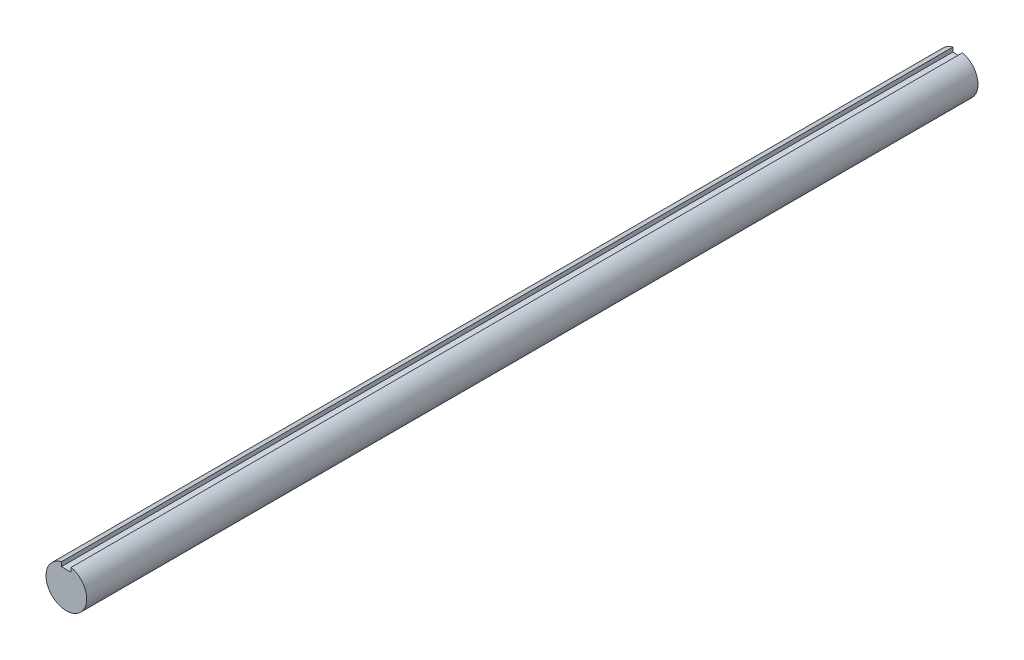
ISO-10303-21;
HEADER;
FILE_DESCRIPTION(('STEP AP214'),'2;1');
FILE_NAME('part.step','',(''),(''),'','','');
FILE_SCHEMA(('AUTOMOTIVE_DESIGN { 1 0 10303 214 1 1 1 1 }'));
ENDSEC;
DATA;
#1=APPLICATION_CONTEXT('core data for automotive mechanical design processes');
#2=APPLICATION_PROTOCOL_DEFINITION('international standard','automotive_design',2000,#1);
#3=PRODUCT_CONTEXT('',#1,'mechanical');
#4=PRODUCT('Part','Part','',(#3));
#5=PRODUCT_RELATED_PRODUCT_CATEGORY('part','',(#4));
#6=PRODUCT_DEFINITION_FORMATION('','',#4);
#7=PRODUCT_DEFINITION_CONTEXT('part definition',#1,'design');
#8=PRODUCT_DEFINITION('design','',#6,#7);
#9=PRODUCT_DEFINITION_SHAPE('','',#8);
#10=(LENGTH_UNIT() NAMED_UNIT(*) SI_UNIT(.MILLI.,.METRE.));
#11=(NAMED_UNIT(*) PLANE_ANGLE_UNIT() SI_UNIT($,.RADIAN.));
#12=(NAMED_UNIT(*) SI_UNIT($,.STERADIAN.) SOLID_ANGLE_UNIT());
#13=UNCERTAINTY_MEASURE_WITH_UNIT(LENGTH_MEASURE(1.E-05),#10,'distance_accuracy_value','');
#14=(GEOMETRIC_REPRESENTATION_CONTEXT(3) GLOBAL_UNCERTAINTY_ASSIGNED_CONTEXT((#13)) GLOBAL_UNIT_ASSIGNED_CONTEXT((#10,
#11,#12)) REPRESENTATION_CONTEXT('',''));
#15=CARTESIAN_POINT('',(0.,0.,0.));
#16=DIRECTION('',(0.,0.,1.));
#17=DIRECTION('',(1.,0.,0.));
#18=AXIS2_PLACEMENT_3D('',#15,#16,#17);
#19=CARTESIAN_POINT('',(0.,0.,173.96333));
#20=DIRECTION('',(0.,0.,-1.));
#21=DIRECTION('',(-1.,0.,0.));
#22=AXIS2_PLACEMENT_3D('',#19,#20,#21);
#23=CYLINDRICAL_SURFACE('',#22,7.93750000000001);
#24=CARTESIAN_POINT('',(0.,0.,-173.96333));
#25=DIRECTION('',(0.,0.,1.));
#26=DIRECTION('',(1.,0.,0.));
#27=AXIS2_PLACEMENT_3D('',#24,#25,#26);
#28=CIRCLE('',#27,7.93750000000001);
#29=CARTESIAN_POINT('',(-1.905,7.70550979818987,-173.96333));
#30=VERTEX_POINT('',#29);
#31=CARTESIAN_POINT('',(1.905,7.70550979818987,-173.96333));
#32=VERTEX_POINT('',#31);
#33=EDGE_CURVE('E95',#30,#32,#28,.T.);
#34=ORIENTED_EDGE('',*,*,#33,.T.);
#35=DIRECTION('',(0.,0.,-1.));
#36=VECTOR('',#35,1.);
#37=CARTESIAN_POINT('',(1.905,7.70550979818987,173.96333));
#38=LINE('',#37,#36);
#39=CARTESIAN_POINT('',(1.905,7.70550979818987,173.96333));
#40=VERTEX_POINT('',#39);
#41=EDGE_CURVE('E11',#40,#32,#38,.T.);
#42=ORIENTED_EDGE('',*,*,#41,.F.);
#43=CARTESIAN_POINT('',(0.,0.,173.96333));
#44=DIRECTION('',(0.,0.,1.));
#45=DIRECTION('',(1.,0.,0.));
#46=AXIS2_PLACEMENT_3D('',#43,#44,#45);
#47=CIRCLE('',#46,7.93750000000001);
#48=CARTESIAN_POINT('',(-1.905,7.70550979818987,173.96333));
#49=VERTEX_POINT('',#48);
#50=EDGE_CURVE('E83',#49,#40,#47,.T.);
#51=ORIENTED_EDGE('',*,*,#50,.F.);
#52=DIRECTION('',(0.,0.,-1.));
#53=VECTOR('',#52,1.);
#54=CARTESIAN_POINT('',(-1.905,7.70550979818987,173.96333));
#55=LINE('',#54,#53);
#56=EDGE_CURVE('E91',#49,#30,#55,.T.);
#57=ORIENTED_EDGE('',*,*,#56,.T.);
#58=EDGE_LOOP('',(#34,#42,#51,#57));
#59=FACE_BOUND('',#58,.T.);
#60=ADVANCED_FACE('F32',(#59),#23,.T.);
#61=CARTESIAN_POINT('',(1.905,7.70550979818987,173.96333));
#62=DIRECTION('',(1.,0.,0.));
#63=DIRECTION('',(0.,0.,-1.));
#64=AXIS2_PLACEMENT_3D('',#61,#62,#63);
#65=PLANE('',#64);
#66=DIRECTION('',(0.,-1.,0.));
#67=VECTOR('',#66,1.);
#68=CARTESIAN_POINT('',(1.905,7.70550979818987,-173.96333));
#69=LINE('',#68,#67);
#70=CARTESIAN_POINT('',(1.905,6.03250000000001,-173.96333));
#71=VERTEX_POINT('',#70);
#72=EDGE_CURVE('E87',#32,#71,#69,.T.);
#73=ORIENTED_EDGE('',*,*,#72,.T.);
#74=DIRECTION('',(0.,0.,-1.));
#75=VECTOR('',#74,1.);
#76=CARTESIAN_POINT('',(1.905,6.03250000000001,173.96333));
#77=LINE('',#76,#75);
#78=CARTESIAN_POINT('',(1.905,6.03250000000001,173.96333));
#79=VERTEX_POINT('',#78);
#80=EDGE_CURVE('E40',#79,#71,#77,.T.);
#81=ORIENTED_EDGE('',*,*,#80,.F.);
#82=DIRECTION('',(0.,-1.,0.));
#83=VECTOR('',#82,1.);
#84=CARTESIAN_POINT('',(1.905,7.70550979818987,173.96333));
#85=LINE('',#84,#83);
#86=EDGE_CURVE('E78',#40,#79,#85,.T.);
#87=ORIENTED_EDGE('',*,*,#86,.F.);
#88=ORIENTED_EDGE('',*,*,#41,.T.);
#89=EDGE_LOOP('',(#73,#81,#87,#88));
#90=FACE_BOUND('',#89,.T.);
#91=ADVANCED_FACE('F86',(#90),#65,.F.);
#92=CARTESIAN_POINT('',(1.905,6.03250000000001,173.96333));
#93=DIRECTION('',(0.,-1.,0.));
#94=DIRECTION('',(0.,0.,-1.));
#95=AXIS2_PLACEMENT_3D('',#92,#93,#94);
#96=PLANE('',#95);
#97=DIRECTION('',(-1.,0.,0.));
#98=VECTOR('',#97,1.);
#99=CARTESIAN_POINT('',(1.905,6.03250000000001,-173.96333));
#100=LINE('',#99,#98);
#101=CARTESIAN_POINT('',(-1.905,6.03250000000001,-173.96333));
#102=VERTEX_POINT('',#101);
#103=EDGE_CURVE('E65',#71,#102,#100,.T.);
#104=ORIENTED_EDGE('',*,*,#103,.T.);
#105=DIRECTION('',(0.,0.,-1.));
#106=VECTOR('',#105,1.);
#107=CARTESIAN_POINT('',(-1.905,6.03250000000001,173.96333));
#108=LINE('',#107,#106);
#109=CARTESIAN_POINT('',(-1.905,6.03250000000001,173.96333));
#110=VERTEX_POINT('',#109);
#111=EDGE_CURVE('E88',#110,#102,#108,.T.);
#112=ORIENTED_EDGE('',*,*,#111,.F.);
#113=DIRECTION('',(-1.,0.,0.));
#114=VECTOR('',#113,1.);
#115=CARTESIAN_POINT('',(1.905,6.03250000000001,173.96333));
#116=LINE('',#115,#114);
#117=EDGE_CURVE('E81',#79,#110,#116,.T.);
#118=ORIENTED_EDGE('',*,*,#117,.F.);
#119=ORIENTED_EDGE('',*,*,#80,.T.);
#120=EDGE_LOOP('',(#104,#112,#118,#119));
#121=FACE_BOUND('',#120,.T.);
#122=ADVANCED_FACE('F89',(#121),#96,.F.);
#123=CARTESIAN_POINT('',(-1.905,6.03250000000001,173.96333));
#124=DIRECTION('',(-1.,0.,0.));
#125=DIRECTION('',(0.,0.,1.));
#126=AXIS2_PLACEMENT_3D('',#123,#124,#125);
#127=PLANE('',#126);
#128=DIRECTION('',(0.,1.,0.));
#129=VECTOR('',#128,1.);
#130=CARTESIAN_POINT('',(-1.905,6.03250000000001,-173.96333));
#131=LINE('',#130,#129);
#132=EDGE_CURVE('E71',#102,#30,#131,.T.);
#133=ORIENTED_EDGE('',*,*,#132,.T.);
#134=ORIENTED_EDGE('',*,*,#56,.F.);
#135=DIRECTION('',(0.,1.,0.));
#136=VECTOR('',#135,1.);
#137=CARTESIAN_POINT('',(-1.905,6.03250000000001,173.96333));
#138=LINE('',#137,#136);
#139=EDGE_CURVE('E48',#110,#49,#138,.T.);
#140=ORIENTED_EDGE('',*,*,#139,.F.);
#141=ORIENTED_EDGE('',*,*,#111,.T.);
#142=EDGE_LOOP('',(#133,#134,#140,#141));
#143=FACE_BOUND('',#142,.T.);
#144=ADVANCED_FACE('F102',(#143),#127,.F.);
#145=CARTESIAN_POINT('',(0.,0.,173.96333));
#146=DIRECTION('',(0.,0.,1.));
#147=DIRECTION('',(1.,0.,0.));
#148=AXIS2_PLACEMENT_3D('',#145,#146,#147);
#149=PLANE('',#148);
#150=ORIENTED_EDGE('',*,*,#50,.T.);
#151=ORIENTED_EDGE('',*,*,#86,.T.);
#152=ORIENTED_EDGE('',*,*,#117,.T.);
#153=ORIENTED_EDGE('',*,*,#139,.T.);
#154=EDGE_LOOP('',(#150,#151,#152,#153));
#155=FACE_BOUND('',#154,.T.);
#156=ADVANCED_FACE('F79',(#155),#149,.T.);
#157=CARTESIAN_POINT('',(0.,0.,-173.96333));
#158=DIRECTION('',(0.,0.,1.));
#159=DIRECTION('',(1.,0.,0.));
#160=AXIS2_PLACEMENT_3D('',#157,#158,#159);
#161=PLANE('',#160);
#162=ORIENTED_EDGE('',*,*,#33,.F.);
#163=ORIENTED_EDGE('',*,*,#132,.F.);
#164=ORIENTED_EDGE('',*,*,#103,.F.);
#165=ORIENTED_EDGE('',*,*,#72,.F.);
#166=EDGE_LOOP('',(#162,#163,#164,#165));
#167=FACE_BOUND('',#166,.T.);
#168=ADVANCED_FACE('F105',(#167),#161,.F.);
#169=CLOSED_SHELL('',(#60,#91,#122,#144,#156,#168));
#170=MANIFOLD_SOLID_BREP('B2',#169);
#171=ADVANCED_BREP_SHAPE_REPRESENTATION('',(#18,#170),#14);
#172=SHAPE_DEFINITION_REPRESENTATION(#9,#171);
ENDSEC;
END-ISO-10303-21;
